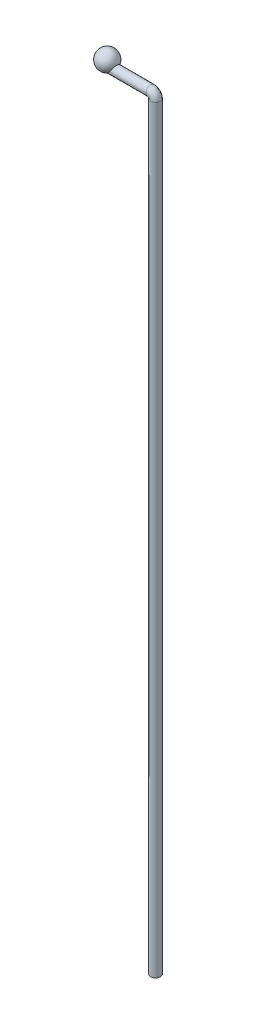
ISO-10303-21;
HEADER;
FILE_DESCRIPTION(('STEP AP214'),'2;1');
FILE_NAME('part.step','',(''),(''),'','','');
FILE_SCHEMA(('AUTOMOTIVE_DESIGN { 1 0 10303 214 1 1 1 1 }'));
ENDSEC;
DATA;
#1=APPLICATION_CONTEXT('core data for automotive mechanical design processes');
#2=APPLICATION_PROTOCOL_DEFINITION('international standard','automotive_design',2000,#1);
#3=PRODUCT_CONTEXT('',#1,'mechanical');
#4=PRODUCT('Part','Part','',(#3));
#5=PRODUCT_RELATED_PRODUCT_CATEGORY('part','',(#4));
#6=PRODUCT_DEFINITION_FORMATION('','',#4);
#7=PRODUCT_DEFINITION_CONTEXT('part definition',#1,'design');
#8=PRODUCT_DEFINITION('design','',#6,#7);
#9=PRODUCT_DEFINITION_SHAPE('','',#8);
#10=(LENGTH_UNIT() NAMED_UNIT(*) SI_UNIT(.MILLI.,.METRE.));
#11=(NAMED_UNIT(*) PLANE_ANGLE_UNIT() SI_UNIT($,.RADIAN.));
#12=(NAMED_UNIT(*) SI_UNIT($,.STERADIAN.) SOLID_ANGLE_UNIT());
#13=UNCERTAINTY_MEASURE_WITH_UNIT(LENGTH_MEASURE(1.E-05),#10,'distance_accuracy_value','');
#14=(GEOMETRIC_REPRESENTATION_CONTEXT(3) GLOBAL_UNCERTAINTY_ASSIGNED_CONTEXT((#13)) GLOBAL_UNIT_ASSIGNED_CONTEXT((#10,
#11,#12)) REPRESENTATION_CONTEXT('',''));
#15=CARTESIAN_POINT('',(0.,0.,0.));
#16=DIRECTION('',(0.,0.,1.));
#17=DIRECTION('',(1.,0.,0.));
#18=AXIS2_PLACEMENT_3D('',#15,#16,#17);
#19=CARTESIAN_POINT('',(-127.,38.1,0.));
#20=DIRECTION('',(0.,1.,0.));
#21=DIRECTION('',(1.,0.,0.));
#22=AXIS2_PLACEMENT_3D('',#19,#20,#21);
#23=SPHERICAL_SURFACE('',#22,25.4);
#24=CARTESIAN_POINT('',(-127.,63.5,0.));
#25=VERTEX_POINT('',#24);
#26=VERTEX_LOOP('',#25);
#27=FACE_BOUND('',#26,.T.);
#28=CARTESIAN_POINT('',(-127.,12.7,0.));
#29=CARTESIAN_POINT('',(-126.753774504649,12.6999956553641,0.246224240013562));
#30=CARTESIAN_POINT('',(-126.507550215351,12.707160485964,0.492449848124196));
#31=CARTESIAN_POINT('',(-126.016222286673,12.735738122103,0.983156202768437));
#32=CARTESIAN_POINT('',(-125.771118218793,12.7570919619295,1.22763995574758));
#33=CARTESIAN_POINT('',(-125.282128924161,12.8138401215974,1.71415056105685));
#34=CARTESIAN_POINT('',(-125.038242856087,12.8491758831438,1.95618339656576));
#35=CARTESIAN_POINT('',(-124.551782722302,12.9336521386807,2.43709526717909));
#36=CARTESIAN_POINT('',(-124.309207415677,12.9827346639298,2.67598322786657));
#37=CARTESIAN_POINT('',(-123.825459655599,13.0944496874087,3.14992641122208));
#38=CARTESIAN_POINT('',(-123.584285563689,13.1570249796385,3.38499344248816));
#39=CARTESIAN_POINT('',(-123.103430184803,13.2954506195254,3.85063486757788));
#40=CARTESIAN_POINT('',(-122.863746858887,13.3712447282324,4.08122387025303));
#41=CARTESIAN_POINT('',(-122.385963647404,13.535814559514,4.53726971674095));
#42=CARTESIAN_POINT('',(-122.147861314726,13.6245352304649,4.76274385753926));
#43=CARTESIAN_POINT('',(-121.67333318239,13.8146471374075,5.2079423944022));
#44=CARTESIAN_POINT('',(-121.436904515382,13.9159847439051,5.42768662911435));
#45=CARTESIAN_POINT('',(-120.965819640736,14.131002951726,5.86082970015092));
#46=CARTESIAN_POINT('',(-120.731160136177,14.2446315892271,6.07425073922251));
#47=CARTESIAN_POINT('',(-120.263717574532,14.4838889401525,6.49417927189171));
#48=CARTESIAN_POINT('',(-120.030930766301,14.6094676017104,6.70071109902101));
#49=CARTESIAN_POINT('',(-119.567332411146,14.8722674317134,7.10630511602729));
#50=CARTESIAN_POINT('',(-119.336516694563,15.0094407050837,7.30539356444873));
#51=CARTESIAN_POINT('',(-118.877008955588,15.2950600630345,7.69561905183343));
#52=CARTESIAN_POINT('',(-118.648312176146,15.443460639189,7.8867837916921));
#53=CARTESIAN_POINT('',(-118.187920351878,15.7546100942176,8.26473276776044));
#54=CARTESIAN_POINT('',(-117.956249270253,15.9175754836223,8.45136812024327));
#55=CARTESIAN_POINT('',(-117.496115889773,16.2537058624002,8.81412298596812));
#56=CARTESIAN_POINT('',(-117.267642820117,16.4267770688346,8.99031570858483));
#57=CARTESIAN_POINT('',(-116.814006894772,16.782534846691,9.33180390673465));
#58=CARTESIAN_POINT('',(-116.588832180447,16.9651333899691,9.49717530260746));
#59=CARTESIAN_POINT('',(-116.141862504074,17.339359425611,9.81663157216136));
#60=CARTESIAN_POINT('',(-115.920054885101,17.5309049205318,9.97079475798642));
#61=CARTESIAN_POINT('',(-115.479905247875,17.9224414095517,10.2674961566954));
#62=CARTESIAN_POINT('',(-115.261549698774,18.1223566265186,10.4101142454862));
#63=CARTESIAN_POINT('',(-114.828410794922,18.5300506734088,10.6834375733927));
#64=CARTESIAN_POINT('',(-114.613612954671,18.7377600933552,10.8142234038779));
#65=CARTESIAN_POINT('',(-114.165654907862,19.182305959707,11.0764664217262));
#66=CARTESIAN_POINT('',(-113.932705950912,19.4200269482403,11.2067886609945));
#67=CARTESIAN_POINT('',(-113.477019581453,19.8974541499635,11.4488340270284));
#68=CARTESIAN_POINT('',(-113.254197244256,20.1368415930049,11.5610257973619));
#69=CARTESIAN_POINT('',(-112.818481528629,20.6160868385274,11.7672827437946));
#70=CARTESIAN_POINT('',(-112.605504982049,20.8556622542875,11.8618279495712));
#71=CARTESIAN_POINT('',(-112.174451745989,21.3510365420413,12.0397345706438));
#72=CARTESIAN_POINT('',(-111.956470052695,21.6071086959378,12.1225663145141));
#73=CARTESIAN_POINT('',(-111.526211304825,22.1235331354273,12.2715735277466));
#74=CARTESIAN_POINT('',(-111.313897518211,22.3838029570839,12.3379286842291));
#75=CARTESIAN_POINT('',(-110.895048045902,22.9077881253897,12.4539879434051));
#76=CARTESIAN_POINT('',(-110.688474555596,23.171434606452,12.5038663027759));
#77=CARTESIAN_POINT('',(-110.27741664793,23.706252137854,12.5877579680277));
#78=CARTESIAN_POINT('',(-110.072961861765,23.9774663249869,12.6216420962943));
#79=CARTESIAN_POINT('',(-109.675376319233,24.5143637024783,12.6710670539237));
#80=CARTESIAN_POINT('',(-109.482105288709,24.779884820529,12.6872351840109));
#81=CARTESIAN_POINT('',(-109.10642629945,25.304098995882,12.7021672225003));
#82=CARTESIAN_POINT('',(-108.923882304628,25.5626763744073,12.7015589957211));
#83=CARTESIAN_POINT('',(-108.549284912852,26.1008215514995,12.6833004154556));
#84=CARTESIAN_POINT('',(-108.357511163938,26.3805426575791,12.6644081828426));
#85=CARTESIAN_POINT('',(-107.981739115787,26.9370383292851,12.6081630882694));
#86=CARTESIAN_POINT('',(-107.797666443177,27.213791588525,12.5711001541656));
#87=CARTESIAN_POINT('',(-107.526407861516,27.6275157374695,12.5017445870358));
#88=CARTESIAN_POINT('',(-107.437280457083,27.764429939504,12.4765107645503));
#89=CARTESIAN_POINT('',(-107.260959259858,28.0372197225315,12.4216607259662));
#90=CARTESIAN_POINT('',(-107.173756246206,28.1730957959215,12.3920767916854));
#91=CARTESIAN_POINT('',(-106.993243637812,28.4562981295252,12.3256026873027));
#92=CARTESIAN_POINT('',(-106.900053499067,28.6036046107511,12.2883030664519));
#93=CARTESIAN_POINT('',(-106.716846197772,28.8952258268008,12.2088697515976));
#94=CARTESIAN_POINT('',(-106.626802026647,29.0395488751392,12.1668289395092));
#95=CARTESIAN_POINT('',(-106.44982255756,29.3250715223223,12.0781001757098));
#96=CARTESIAN_POINT('',(-106.362860435821,29.4662826503434,12.0315028957374));
#97=CARTESIAN_POINT('',(-106.191974535145,29.7454515438046,11.9338289198293));
#98=CARTESIAN_POINT('',(-106.108024252691,29.8834240636262,11.8828408184076));
#99=CARTESIAN_POINT('',(-105.943095287638,30.1560036764816,11.7765619727197));
#100=CARTESIAN_POINT('',(-105.862090389651,30.2906284738001,11.7213573952273));
#101=CARTESIAN_POINT('',(-105.702973982659,30.5563856973382,11.6067816651627));
#102=CARTESIAN_POINT('',(-105.624836771076,30.6875390278628,11.5474947164137));
#103=CARTESIAN_POINT('',(-105.465977771979,30.9554971172227,11.4206720524418));
#104=CARTESIAN_POINT('',(-105.385343908504,31.0922251291107,11.3528638974333));
#105=CARTESIAN_POINT('',(-105.226660799548,31.3627909879235,11.2125362759446));
#106=CARTESIAN_POINT('',(-105.14859487878,31.4966437503177,11.1400644173273));
#107=CARTESIAN_POINT('',(-104.995021344529,31.7613563704438,10.9905081753271));
#108=CARTESIAN_POINT('',(-104.919497616507,31.8922320023528,10.9134682781425));
#109=CARTESIAN_POINT('',(-104.770995625425,32.1509189380803,10.7549103796883));
#110=CARTESIAN_POINT('',(-104.69800177402,32.2787464225339,10.6734333829029));
#111=CARTESIAN_POINT('',(-104.554544175422,32.5312624923444,10.5061195088232));
#112=CARTESIAN_POINT('',(-104.484065471849,32.6559675025301,10.4203202514909));
#113=CARTESIAN_POINT('',(-104.345629252441,32.9021846263749,10.2444951740888));
#114=CARTESIAN_POINT('',(-104.277657452137,33.0237130640664,10.1545034622352));
#115=CARTESIAN_POINT('',(-104.14238582797,33.2667651091497,9.96784566506509));
#116=CARTESIAN_POINT('',(-104.075129254282,33.3882362321036,9.87107979944097));
#117=CARTESIAN_POINT('',(-103.94377337183,33.6265228012199,9.6739972968939));
#118=CARTESIAN_POINT('',(-103.87964241403,33.743380224203,9.57375254066035));
#119=CARTESIAN_POINT('',(-103.754462099808,33.9723903624786,9.3698899951435));
#120=CARTESIAN_POINT('',(-103.693382104431,34.0845861132614,9.26633939553716));
#121=CARTESIAN_POINT('',(-103.574226256523,34.3042129081055,9.05601623688469));
#122=CARTESIAN_POINT('',(-103.516120924482,34.4116878989443,8.94930629311368));
#123=CARTESIAN_POINT('',(-103.40284295382,34.6218404932908,8.73282386249817));
#124=CARTESIAN_POINT('',(-103.347642048003,34.7245622459905,8.62310906688751));
#125=CARTESIAN_POINT('',(-103.240095963247,34.9251193145634,8.40071968432931));
#126=CARTESIAN_POINT('',(-103.187723940768,35.0229993021968,8.28809836461734));
#127=CARTESIAN_POINT('',(-103.081030970454,35.2229410490078,8.04951409547492));
#128=CARTESIAN_POINT('',(-103.026897367468,35.3246964915704,7.92321058345928));
#129=CARTESIAN_POINT('',(-102.92177473333,35.5230632501514,7.66728054072635));
#130=CARTESIAN_POINT('',(-102.870762671307,35.619711266449,7.53769190772291));
#131=CARTESIAN_POINT('',(-102.771830280934,35.8077822474376,7.27528777834274));
#132=CARTESIAN_POINT('',(-102.723889101488,35.8992398269625,7.14250496917492));
#133=CARTESIAN_POINT('',(-102.631060798639,36.0769241749949,6.87385374324224));
#134=CARTESIAN_POINT('',(-102.586155087695,36.1631823450298,6.73801252339527));
#135=CARTESIAN_POINT('',(-102.499362242747,36.3304312706275,6.46335430345532));
#136=CARTESIAN_POINT('',(-102.457458975126,36.411449908624,6.32455938198096));
#137=CARTESIAN_POINT('',(-102.376647019459,36.5682609251933,6.04413517241294));
#138=CARTESIAN_POINT('',(-102.337724788271,36.6440767541134,5.90252290404002));
#139=CARTESIAN_POINT('',(-102.261392838599,36.7930979476223,5.61093227197096));
#140=CARTESIAN_POINT('',(-102.224082847868,36.8661207343867,5.4608342507374));
#141=CARTESIAN_POINT('',(-102.152703975155,37.0058963252319,5.15788554331843));
#142=CARTESIAN_POINT('',(-102.118620684945,37.0726769835998,5.00505110916182));
#143=CARTESIAN_POINT('',(-102.053673296389,37.2000228034903,4.69676455241232));
#144=CARTESIAN_POINT('',(-102.022798806089,37.2606080185034,4.54132290228054));
#145=CARTESIAN_POINT('',(-101.964254098973,37.375544905229,4.22791339918709));
#146=CARTESIAN_POINT('',(-101.936577736043,37.4299085314978,4.06995107881202));
#147=CARTESIAN_POINT('',(-101.884427028816,37.5324202573725,3.75159654126638));
#148=CARTESIAN_POINT('',(-101.85995097741,37.5805716705143,3.59120567090283));
#149=CARTESIAN_POINT('',(-101.814209547787,37.6706210863132,3.26806878016279));
#150=CARTESIAN_POINT('',(-101.792947075859,37.7125134280212,3.10532077206372));
#151=CARTESIAN_POINT('',(-101.753814002254,37.7898960345377,2.77889970787162));
#152=CARTESIAN_POINT('',(-101.735924789951,37.8254213695003,2.61523718381334));
#153=CARTESIAN_POINT('',(-101.703570708639,37.8899877128467,2.28788005030676));
#154=CARTESIAN_POINT('',(-101.68907583982,37.9190853889996,2.1241995982702));
#155=CARTESIAN_POINT('',(-101.66342729008,37.9707603086243,1.79688020672011));
#156=CARTESIAN_POINT('',(-101.652248184514,37.993387118774,1.63325110057531));
#157=CARTESIAN_POINT('',(-101.633161196761,38.0321393598604,1.30611252128707));
#158=CARTESIAN_POINT('',(-101.625232589544,38.0483059635051,1.14260914180085));
#159=CARTESIAN_POINT('',(-101.612589997304,38.0741411566048,0.815790855417534));
#160=CARTESIAN_POINT('',(-101.607860089868,38.0838419279934,0.652479115703147));
#161=CARTESIAN_POINT('',(-101.601570079233,38.0967634279735,0.326111873599956));
#162=CARTESIAN_POINT('',(-101.599998938979,38.1000067192704,0.163057475141623));
#163=CARTESIAN_POINT('',(-101.6,38.1,0.));
#164=B_SPLINE_CURVE_WITH_KNOTS('',3,(#28,#29,#30,#31,#32,#33,#34,#35,#36,#37,#38,#39,#40,#41,
#42,#43,#44,#45,#46,#47,#48,#49,#50,#51,#52,#53,#54,#55,#56,#57,#58,#59,#60,#61,#62,#63,#64,#65,
#66,#67,#68,#69,#70,#71,#72,#73,#74,#75,#76,#77,#78,#79,#80,#81,#82,#83,#84,#85,#86,#87,#88,#89,
#90,#91,#92,#93,#94,#95,#96,#97,#98,#99,#100,#101,#102,#103,#104,#105,#106,#107,#108,#109,#110,
#111,#112,#113,#114,#115,#116,#117,#118,#119,#120,#121,#122,#123,#124,#125,#126,#127,#128,#129,
#130,#131,#132,#133,#134,#135,#136,#137,#138,#139,#140,#141,#142,#143,#144,#145,#146,#147,#148,
#149,#150,#151,#152,#153,#154,#155,#156,#157,#158,#159,#160,#161,#162,#163),.UNSPECIFIED.,.F.,
.F.,(4,2,2,2,2,2,2,2,2,2,2,2,2,2,2,2,2,2,2,2,2,2,2,2,2,2,2,2,2,2,2,2,2,2,2,2,2,2,2,2,2,2,2,2,2,
2,2,2,2,2,2,2,2,2,2,2,2,2,2,2,2,2,2,2,2,2,2,4),(0.,1.0445700819187,2.08482613566929,
3.12077079455875,4.1524111004046,5.17976061701431,6.20284143729002,7.22168605182327,
8.23633904893215,9.24685861841826,10.2533178338883,11.2558056913139,12.2544278846071,
13.2717346966274,14.280763783647,15.2817183024105,16.2748264359061,17.2603408417071,
18.2385376938837,19.3104040318715,20.3472410943698,21.349471384914,22.3880336742282,
23.4147162301865,24.4301644625497,25.4536792906385,26.4396479167016,27.3887679656882,
28.4072322885494,29.4099505613035,29.9058101738851,30.3981601894718,30.9328339442793,
31.4584249853378,31.9751224697633,32.4831233105693,32.9826327083895,33.4738646994203,
33.9915932399343,34.504687234271,35.0134160983113,35.518052954117,36.0188745240987,
36.5161610177328,37.0237719790458,37.5240186306781,38.0172360089446,38.5037747453433,
38.9840014716523,39.4582991057576,39.9711303759995,40.479553318306,40.9840461261481,
41.4851006601572,41.9832216681063,42.4789258075568,42.9918752758221,43.5024140247149,
44.0112441484888,44.5190795486341,45.0266429443129,45.5346626568678,46.0397918532584,
46.5402722298097,47.0368094425876,47.5301295837438,48.0209756475941,48.5101036438047),.UNSPECIFIED.);
#165=CARTESIAN_POINT('',(-101.6,38.1,0.));
#166=VERTEX_POINT('',#165);
#167=CARTESIAN_POINT('',(-127.,12.7,0.));
#168=VERTEX_POINT('',#167);
#169=EDGE_CURVE('E48',#166,#168,#164,.F.);
#170=ORIENTED_EDGE('',*,*,#169,.F.);
#171=CARTESIAN_POINT('',(-101.6,38.1,0.));
#172=CARTESIAN_POINT('',(-101.599998939091,38.1000067163788,-0.163053066388681));
#173=CARTESIAN_POINT('',(-101.601569994264,38.0967633916306,-0.326103047690552));
#174=CARTESIAN_POINT('',(-101.607859698727,38.0838418938605,-0.652463229805624));
#175=CARTESIAN_POINT('',(-101.612589418931,38.074141088182,-0.815772323264975));
#176=CARTESIAN_POINT('',(-101.625231602347,38.0483058922104,-1.14258708883033));
#177=CARTESIAN_POINT('',(-101.63316002188,38.0321392514457,-1.30608958697299));
#178=CARTESIAN_POINT('',(-101.65224670245,37.9933870213364,-1.63322818107304));
#179=CARTESIAN_POINT('',(-101.663425722407,37.9707601934451,-1.79685817360477));
#180=CARTESIAN_POINT('',(-101.689074270492,37.9190852366738,-2.12418109084354));
#181=CARTESIAN_POINT('',(-101.703569257083,37.8899874778797,-2.2878641695785));
#182=CARTESIAN_POINT('',(-101.735923850064,37.8254212826178,-2.61522837286625));
#183=CARTESIAN_POINT('',(-101.75381349003,37.7898961225116,-2.77889532595306));
#184=CARTESIAN_POINT('',(-101.792946086614,37.7125163143041,-3.10531263039306));
#185=CARTESIAN_POINT('',(-101.814207403345,37.6706270669479,-3.26805259148908));
#186=CARTESIAN_POINT('',(-101.859946641723,37.5805825308861,-3.59117664476431));
#187=CARTESIAN_POINT('',(-101.88442172301,37.5324327756508,-3.75156267981031));
#188=CARTESIAN_POINT('',(-101.93657081992,37.4299233719986,-4.06991085955655));
#189=CARTESIAN_POINT('',(-101.96424660788,37.3755602832536,-4.22787160593066));
#190=CARTESIAN_POINT('',(-102.022790701348,37.2606234165812,-4.54128123701806));
#191=CARTESIAN_POINT('',(-102.053665217351,37.2000375588751,-4.6967245312055));
#192=CARTESIAN_POINT('',(-102.11861339375,37.0726893270626,-5.00501757331042));
#193=CARTESIAN_POINT('',(-102.152697509548,37.0059067780969,-5.15785678526688));
#194=CARTESIAN_POINT('',(-102.224078993726,36.8661266176219,-5.46081836429368));
#195=CARTESIAN_POINT('',(-102.261390832824,36.7931010361696,-5.61092441138632));
#196=CARTESIAN_POINT('',(-102.33772278599,36.644081462508,-5.90251544702451));
#197=CARTESIAN_POINT('',(-102.376642865925,36.5682706094116,-6.0441204591527));
#198=CARTESIAN_POINT('',(-102.457451036799,36.411467454251,-6.32453311940945));
#199=CARTESIAN_POINT('',(-102.499352730486,36.330451593663,-6.46332367028303));
#200=CARTESIAN_POINT('',(-102.586143169117,36.1632064666656,-6.73797622795508));
#201=CARTESIAN_POINT('',(-102.631048106806,36.0769492139426,-6.8738160741978));
#202=CARTESIAN_POINT('',(-102.723875804925,35.8992648714721,-7.14246753577535));
#203=CARTESIAN_POINT('',(-102.771817211503,35.8078062811189,-7.27525186846009));
#204=CARTESIAN_POINT('',(-102.870751191995,35.6197314043615,-7.53766190898217));
#205=CARTESIAN_POINT('',(-102.921764674957,35.5230804090228,-7.66725484028941));
#206=CARTESIAN_POINT('',(-103.026891523432,35.3247060803644,-7.92319645397948));
#207=CARTESIAN_POINT('',(-103.081027977703,35.2229459623559,-8.04950714974479));
#208=CARTESIAN_POINT('',(-103.187721259667,35.0230049693083,-8.28809260354821));
#209=CARTESIAN_POINT('',(-103.240090486513,34.92513083041,-8.40070838676526));
#210=CARTESIAN_POINT('',(-103.347631803138,34.7245830420408,-8.62308901205869));
#211=CARTESIAN_POINT('',(-103.402830780279,34.6218646375559,-8.73280049099449));
#212=CARTESIAN_POINT('',(-103.516105922489,34.4117165637831,-8.94927870960166));
#213=CARTESIAN_POINT('',(-103.574210399519,34.3042426725568,-9.05598766396695));
#214=CARTESIAN_POINT('',(-103.69336573239,34.0846158521374,-9.26631113382693));
#215=CARTESIAN_POINT('',(-103.754446112793,33.9724189089949,-9.36986293850665));
#216=CARTESIAN_POINT('',(-103.879628554132,33.7434041427309,-9.57373004249378));
#217=CARTESIAN_POINT('',(-103.943761299423,33.6265432233694,-9.67397805603386));
#218=CARTESIAN_POINT('',(-104.075122330111,33.3882476000406,-9.8710692897527));
#219=CARTESIAN_POINT('',(-104.142382311061,33.2667708673993,-9.96784053597946));
#220=CARTESIAN_POINT('',(-104.277653896968,33.0237200012529,-10.1544988270981));
#221=CARTESIAN_POINT('',(-104.345622031718,32.9021986198224,-10.2444861598619));
#222=CARTESIAN_POINT('',(-104.484052082864,32.6559926984381,-10.4203043975236));
#223=CARTESIAN_POINT('',(-104.554528326226,32.5312917814417,-10.5061010867364));
#224=CARTESIAN_POINT('',(-104.697982391406,32.2787811777217,-10.6734118103415));
#225=CARTESIAN_POINT('',(-104.770975211676,32.1509550186865,-10.754888117084));
#226=CARTESIAN_POINT('',(-104.919476692558,31.8922680001297,-10.9134464485465));
#227=CARTESIAN_POINT('',(-104.995000982899,31.7613909170138,-10.9904873600763));
#228=CARTESIAN_POINT('',(-105.148577350548,31.4966726699021,-11.140047261053));
#229=CARTESIAN_POINT('',(-105.226645583004,31.3628156933458,-11.2125216547212));
#230=CARTESIAN_POINT('',(-105.38533524678,31.0922388424757,-11.3528560080725));
#231=CARTESIAN_POINT('',(-105.465973394153,30.9555040207751,-11.42066825265));
#232=CARTESIAN_POINT('',(-105.624832716366,30.6875463233762,-11.5474917685878));
#233=CARTESIAN_POINT('',(-105.702965789344,30.5564003510182,-11.6067760306093));
#234=CARTESIAN_POINT('',(-105.862075311433,30.2906547972376,-11.7213476665179));
#235=CARTESIAN_POINT('',(-105.943077492469,30.1560342799854,-11.7765507233903));
#236=CARTESIAN_POINT('',(-106.108002621904,29.8834603340363,-11.8828278428138));
#237=CARTESIAN_POINT('',(-106.191951817248,29.7454891778487,-11.9338156302877));
#238=CARTESIAN_POINT('',(-106.362837278046,29.4663201338498,-12.0314900975172));
#239=CARTESIAN_POINT('',(-106.449800079362,29.3251074735313,-12.0780880748538));
#240=CARTESIAN_POINT('',(-106.62678277607,29.0395789264084,-12.1668191596695));
#241=CARTESIAN_POINT('',(-106.716829528445,28.8952514976686,-12.2088614884615));
#242=CARTESIAN_POINT('',(-106.900044057972,28.6036188159664,-12.2882987289079));
#243=CARTESIAN_POINT('',(-106.993238878762,28.4563052430973,-12.32560065529));
#244=CARTESIAN_POINT('',(-107.173751598712,28.1731034121138,-12.3920753375702));
#245=CARTESIAN_POINT('',(-107.260949891139,28.0372349593425,-12.4216580623388));
#246=CARTESIAN_POINT('',(-107.437263305668,27.7644572390968,-12.4765064151142));
#247=CARTESIAN_POINT('',(-107.526387675822,27.6275474764248,-12.5017396598976));
#248=CARTESIAN_POINT('',(-107.797642830333,27.2138275618271,-12.571095238583));
#249=CARTESIAN_POINT('',(-107.98171506298,26.9370739991077,-12.6081583892573));
#250=CARTESIAN_POINT('',(-108.357494633697,26.3805661641619,-12.6644059884031));
#251=CARTESIAN_POINT('',(-108.549276556495,26.1008332618933,-12.68329972347));
#252=CARTESIAN_POINT('',(-108.923874629516,25.5626876746987,-12.701558886897));
#253=CARTESIAN_POINT('',(-109.106410791714,25.3041214977484,-12.7021677042414));
#254=CARTESIAN_POINT('',(-109.482081421291,24.7799180742599,-12.6872371421842));
#255=CARTESIAN_POINT('',(-109.675352059175,24.5143966222113,-12.6710691807981));
#256=CARTESIAN_POINT('',(-110.072945267556,23.977487856079,-12.6216443016669));
#257=CARTESIAN_POINT('',(-110.27740828254,23.7062628009102,-12.5877594171079));
#258=CARTESIAN_POINT('',(-110.688465706986,23.1714463383564,-12.5038683647968));
#259=CARTESIAN_POINT('',(-110.895030171898,22.9078113379015,-12.4539927422795));
#260=CARTESIAN_POINT('',(-111.313870108383,22.3838369824599,-12.3379371785717));
#261=CARTESIAN_POINT('',(-111.526183530084,22.1235667629618,-12.2715822861146));
#262=CARTESIAN_POINT('',(-111.956451162936,21.6071305308121,-12.1225730028581));
#263=CARTESIAN_POINT('',(-112.174442248454,21.3510472928641,-12.0397382572052));
#264=CARTESIAN_POINT('',(-112.605496095825,20.8556726246701,-11.8618318422731));
#265=CARTESIAN_POINT('',(-112.818463634775,20.61610725822,-11.7672911152594));
#266=CARTESIAN_POINT('',(-113.254169960366,20.1368713003689,-11.5610395160328));
#267=CARTESIAN_POINT('',(-113.476992006046,19.8974834344371,-11.4488480159485));
#268=CARTESIAN_POINT('',(-113.932687250644,19.4200457847643,-11.2067987060006));
#269=CARTESIAN_POINT('',(-114.165645488634,19.1823151654125,-11.0764716876004));
#270=CARTESIAN_POINT('',(-114.613607389984,18.7377657450314,-10.8142268881525));
#271=CARTESIAN_POINT('',(-114.828399641155,18.5300617467979,-10.6834448859017));
#272=CARTESIAN_POINT('',(-115.261529382355,18.1223758491251,-10.4101280620676));
#273=CARTESIAN_POINT('',(-115.479881376847,17.9224634566743,-10.2675125340582));
#274=CARTESIAN_POINT('',(-115.920026135573,17.5309302283617,-9.97081496151973));
#275=CARTESIAN_POINT('',(-116.141832448841,17.3393852724528,-9.81665293204851));
#276=CARTESIAN_POINT('',(-116.588801832691,16.9651582384374,-9.49719739252339));
#277=CARTESIAN_POINT('',(-116.813977577023,16.782558266139,-9.33182546650587));
#278=CARTESIAN_POINT('',(-117.267617970039,16.4267958948321,-8.9903343861434));
#279=CARTESIAN_POINT('',(-117.496094493141,16.2537216378245,-8.81413921347253));
#280=CARTESIAN_POINT('',(-117.956237283491,15.9175837860884,-8.45137743177531));
#281=CARTESIAN_POINT('',(-118.187914336153,15.7546140935121,-8.26473752120111));
#282=CARTESIAN_POINT('',(-118.648310431502,15.4434618834117,-7.88678540555803));
#283=CARTESIAN_POINT('',(-118.877005466801,15.2950624597438,-7.69562235576367));
#284=CARTESIAN_POINT('',(-119.336509971587,15.0094450038176,-7.30539999875862));
#285=CARTESIAN_POINT('',(-119.567324199647,14.8722724968164,-7.10631298008203));
#286=CARTESIAN_POINT('',(-120.030919876746,14.6094738452913,-6.70072157592981));
#287=CARTESIAN_POINT('',(-120.263705496857,14.483895613164,-6.49419092224918));
#288=CARTESIAN_POINT('',(-120.731145990463,14.2446388161745,-6.07426445505132));
#289=CARTESIAN_POINT('',(-120.965804616355,14.1310103209591,-5.86084429919206));
#290=CARTESIAN_POINT('',(-121.436888057623,13.9159921451124,-5.42770269253815));
#291=CARTESIAN_POINT('',(-121.673316171036,13.8146544465177,-5.20795903108747));
#292=CARTESIAN_POINT('',(-122.147843531079,13.6245421571722,-4.76276131860193));
#293=CARTESIAN_POINT('',(-122.385945646041,13.5358212145364,-4.5372874219298));
#294=CARTESIAN_POINT('',(-122.863728766149,13.3712506980537,-4.08124172593846));
#295=CARTESIAN_POINT('',(-123.103412219263,13.2954561948297,-3.85065262358772));
#296=CARTESIAN_POINT('',(-123.584268203133,13.1570296821183,-3.38501064947612));
#297=CARTESIAN_POINT('',(-123.82544277356,13.0944539309292,-3.1499431637821));
#298=CARTESIAN_POINT('',(-124.309191845371,12.982737965172,-2.67599871414582));
#299=CARTESIAN_POINT('',(-124.551767985812,12.9336549762704,-2.43710993750791));
#300=CARTESIAN_POINT('',(-125.038230143468,12.8491778295659,-1.95619607401718));
#301=CARTESIAN_POINT('',(-125.282117402062,12.8138416604571,-1.71416205848534));
#302=CARTESIAN_POINT('',(-125.771109433057,12.7570927830989,-1.22764873310298));
#303=CARTESIAN_POINT('',(-126.016215047107,12.7357386533529,-0.983163437996531));
#304=CARTESIAN_POINT('',(-126.507546419425,12.7071605963551,-0.492453644026978));
#305=CARTESIAN_POINT('',(-126.753772606363,12.6999956552359,-0.246226137671315));
#306=CARTESIAN_POINT('',(-127.,12.7,0.));
#307=B_SPLINE_CURVE_WITH_KNOTS('',3,(#171,#172,#173,#174,#175,#176,#177,#178,#179,#180,#181,
#182,#183,#184,#185,#186,#187,#188,#189,#190,#191,#192,#193,#194,#195,#196,#197,#198,#199,#200,
#201,#202,#203,#204,#205,#206,#207,#208,#209,#210,#211,#212,#213,#214,#215,#216,#217,#218,#219,
#220,#221,#222,#223,#224,#225,#226,#227,#228,#229,#230,#231,#232,#233,#234,#235,#236,#237,#238,
#239,#240,#241,#242,#243,#244,#245,#246,#247,#248,#249,#250,#251,#252,#253,#254,#255,#256,#257,
#258,#259,#260,#261,#262,#263,#264,#265,#266,#267,#268,#269,#270,#271,#272,#273,#274,#275,#276,
#277,#278,#279,#280,#281,#282,#283,#284,#285,#286,#287,#288,#289,#290,#291,#292,#293,#294,#295,
#296,#297,#298,#299,#300,#301,#302,#303,#304,#305,#306),.UNSPECIFIED.,.F.,.F.,(4,2,2,2,2,2,2,2,
2,2,2,2,2,2,2,2,2,2,2,2,2,2,2,2,2,2,2,2,2,2,2,2,2,2,2,2,2,2,2,2,2,2,2,2,2,2,2,2,2,2,2,2,2,2,2,2,
2,2,2,2,2,2,2,2,2,2,2,4),(0.,0.489114757193677,0.979952890016324,1.47327039565273,
1.96981023191384,2.4702984317304,2.97544057091204,3.48343435170483,3.99098214646978,
4.4988123449358,5.00764768629515,5.51820204329118,6.03117743318308,6.52685455129662,
7.02495933064836,7.52600847284828,8.0305067281123,8.53894591914447,9.051804162831,
9.52607632944626,10.0062877875799,10.4928214703107,10.9860439919825,11.4863059365974,
11.9939422655313,12.491201605677,12.9920069238951,13.4966384169933,14.0053727711325,
14.5184830501263,15.0362385913277,15.5274440667513,16.0269376032543,16.5349332139523,
17.051636059288,17.5772429971197,18.1119431164759,18.6042660346438,19.1001094396096,
20.1028278307863,21.1213353443324,22.0704144260229,23.0563831409099,24.0799388498027,
25.0953425815685,26.1220252129408,27.1606319283432,28.1628196272162,29.1996567387182,
30.2715656207161,31.2497364927884,32.2352353321949,33.2283382968387,34.2292980286497,
35.2383426962336,36.2556754437559,37.2542895994985,38.256770879087,39.2632249774746,
40.2737408914609,41.2883916953024,42.3072355793002,43.3303171321458,44.3576688446975,
45.3893128100364,46.4252625920775,47.4655252326922,48.5101033652042),.UNSPECIFIED.);
#308=EDGE_CURVE('E39',#168,#166,#307,.F.);
#309=ORIENTED_EDGE('',*,*,#308,.F.);
#310=EDGE_LOOP('',(#170,#309));
#311=FACE_BOUND('',#310,.T.);
#312=ADVANCED_FACE('F16',(#27,#311),#23,.T.);
#313=CARTESIAN_POINT('',(-12.7,25.4,0.));
#314=DIRECTION('',(-1.,0.,0.));
#315=DIRECTION('',(0.,0.,1.));
#316=AXIS2_PLACEMENT_3D('',#313,#314,#315);
#317=CYLINDRICAL_SURFACE('',#316,12.7);
#318=CARTESIAN_POINT('',(-12.6999999999975,25.4,0.));
#319=DIRECTION('',(-1.,0.,0.));
#320=DIRECTION('',(0.,0.,1.));
#321=AXIS2_PLACEMENT_3D('',#318,#319,#320);
#322=CIRCLE('',#321,12.7);
#323=CARTESIAN_POINT('',(-12.6999999999987,12.6999999999987,0.));
#324=VERTEX_POINT('',#323);
#325=EDGE_CURVE('E21',#324,#324,#322,.T.);
#326=ORIENTED_EDGE('',*,*,#325,.T.);
#327=EDGE_LOOP('',(#326));
#328=FACE_BOUND('',#327,.T.);
#329=ORIENTED_EDGE('',*,*,#169,.T.);
#330=ORIENTED_EDGE('',*,*,#308,.T.);
#331=EDGE_LOOP('',(#329,#330));
#332=FACE_BOUND('',#331,.T.);
#333=ADVANCED_FACE('F47',(#328,#332),#317,.T.);
#334=CARTESIAN_POINT('',(-12.7000000000028,12.7000000000023,-4.89985893365814E-12));
#335=CARTESIAN_POINT('',(-12.6999999999969,12.7000000000023,-4.89985893365308E-12));
#336=CARTESIAN_POINT('',(-12.6999999999969,12.6999999999964,-4.89985893365258E-12));
#337=CARTESIAN_POINT('',(-12.7000000000137,12.7000000000034,12.6999999999934));
#338=CARTESIAN_POINT('',(-12.7000000000078,12.7000000000034,12.6999999999934));
#339=CARTESIAN_POINT('',(-12.7000000000078,12.6999999999975,12.6999999999934));
#340=CARTESIAN_POINT('',(-12.7000000000137,25.4000000000018,12.6999999999923));
#341=CARTESIAN_POINT('',(-5.01598762525645E-12,25.4000000000061,12.7000000000032));
#342=CARTESIAN_POINT('',(-9.49018641449584E-12,12.6999999999975,12.7000000000043));
#343=CARTESIAN_POINT('',(-12.7000000000137,38.1,12.6999999999912));
#344=CARTESIAN_POINT('',(12.6999999999978,38.1000000000089,12.700000000013));
#345=CARTESIAN_POINT('',(12.6999999999888,12.6999999999975,12.7000000000152));
#346=CARTESIAN_POINT('',(-12.7000000000028,38.099999999999,-7.07788994547798E-12));
#347=CARTESIAN_POINT('',(12.7000000000087,38.1000000000079,1.46901806297394E-11));
#348=CARTESIAN_POINT('',(12.6999999999997,12.6999999999964,1.68666563401179E-11));
#349=CARTESIAN_POINT('',(-12.6999999999919,38.0999999999977,-12.7000000000054));
#350=CARTESIAN_POINT('',(12.7000000000196,38.1000000000069,-12.6999999999836));
#351=CARTESIAN_POINT('',(12.7000000000106,12.6999999999953,-12.6999999999815));
#352=CARTESIAN_POINT('',(-12.6999999999919,25.3999999999995,-12.7000000000043));
#353=CARTESIAN_POINT('',(1.67532654415936E-11,25.4000000000041,-12.6999999999934));
#354=CARTESIAN_POINT('',(1.22790666523542E-11,12.6999999999953,-12.6999999999923));
#355=CARTESIAN_POINT('',(-12.6999999999919,12.7000000000012,-12.7000000000032));
#356=CARTESIAN_POINT('',(-12.699999999986,12.7000000000012,-12.7000000000032));
#357=CARTESIAN_POINT('',(-12.699999999986,12.6999999999953,-12.7000000000032));
#358=CARTESIAN_POINT('',(-12.7000000000028,12.7000000000023,-4.89985893365814E-12));
#359=CARTESIAN_POINT('',(-12.6999999999969,12.7000000000023,-4.89985893365308E-12));
#360=CARTESIAN_POINT('',(-12.6999999999969,12.6999999999964,-4.89985893365258E-12));
#361=(BOUNDED_SURFACE() B_SPLINE_SURFACE(2,2,((#334,#335,#336),(#337,#338,#339),(#340,#341,
#342),(#343,#344,#345),(#346,#347,#348),(#349,#350,#351),(#352,#353,#354),(#355,#356,#357),
(#358,#359,#360)),.UNSPECIFIED.,.T.,.F.,.F.) B_SPLINE_SURFACE_WITH_KNOTS((3,2,2,2,3),(3,3),
(-3.14159265358979,-1.5707963267949,0.,1.5707963267949,3.14159265358979),(1.57079632679435,
3.14159265358995),.UNSPECIFIED.) GEOMETRIC_REPRESENTATION_ITEM() RATIONAL_B_SPLINE_SURFACE(((1.,
0.707106781186298,1.),(0.707106781186547,0.499999999999823,0.707106781186547),(1.,
0.707106781186298,1.),(0.707106781186548,0.499999999999824,0.707106781186548),(1.,
0.707106781186298,1.),(0.707106781186548,0.499999999999824,0.707106781186548),(1.,
0.707106781186298,1.),(0.707106781186547,0.499999999999823,0.707106781186547),(1.,
0.707106781186298,1.))) REPRESENTATION_ITEM('') SURFACE());
#362=CARTESIAN_POINT('',(0.,12.6999999999975,0.));
#363=DIRECTION('',(0.,1.,0.));
#364=DIRECTION('',(0.,0.,1.));
#365=AXIS2_PLACEMENT_3D('',#362,#363,#364);
#366=CIRCLE('',#365,12.7);
#367=EDGE_CURVE('E26',#324,#324,#366,.F.);
#368=ORIENTED_EDGE('',*,*,#325,.F.);
#369=ORIENTED_EDGE('',*,*,#367,.F.);
#370=EDGE_LOOP('',(#368,#369));
#371=FACE_BOUND('',#370,.T.);
#372=ADVANCED_FACE('F68',(#371),#361,.F.);
#373=CARTESIAN_POINT('',(0.,-1981.2,0.));
#374=DIRECTION('',(0.,1.,0.));
#375=DIRECTION('',(0.,0.,1.));
#376=AXIS2_PLACEMENT_3D('',#373,#374,#375);
#377=PLANE('',#376);
#378=CARTESIAN_POINT('',(0.,-1981.2,0.));
#379=DIRECTION('',(0.,1.,0.));
#380=DIRECTION('',(0.,0.,1.));
#381=AXIS2_PLACEMENT_3D('',#378,#379,#380);
#382=CIRCLE('',#381,12.7);
#383=CARTESIAN_POINT('',(0.,-1981.2,12.7));
#384=VERTEX_POINT('',#383);
#385=EDGE_CURVE('E11',#384,#384,#382,.T.);
#386=ORIENTED_EDGE('',*,*,#385,.F.);
#387=EDGE_LOOP('',(#386));
#388=FACE_BOUND('',#387,.T.);
#389=ADVANCED_FACE('F74',(#388),#377,.F.);
#390=CARTESIAN_POINT('',(0.,0.,0.));
#391=DIRECTION('',(0.,1.,0.));
#392=DIRECTION('',(0.,0.,1.));
#393=AXIS2_PLACEMENT_3D('',#390,#391,#392);
#394=CYLINDRICAL_SURFACE('',#393,12.7);
#395=ORIENTED_EDGE('',*,*,#385,.T.);
#396=EDGE_LOOP('',(#395));
#397=FACE_BOUND('',#396,.T.);
#398=ORIENTED_EDGE('',*,*,#367,.T.);
#399=EDGE_LOOP('',(#398));
#400=FACE_BOUND('',#399,.T.);
#401=ADVANCED_FACE('F83',(#397,#400),#394,.T.);
#402=CLOSED_SHELL('',(#312,#333,#372,#389,#401));
#403=MANIFOLD_SOLID_BREP('B1',#402);
#404=ADVANCED_BREP_SHAPE_REPRESENTATION('',(#18,#403),#14);
#405=SHAPE_DEFINITION_REPRESENTATION(#9,#404);
ENDSEC;
END-ISO-10303-21;
